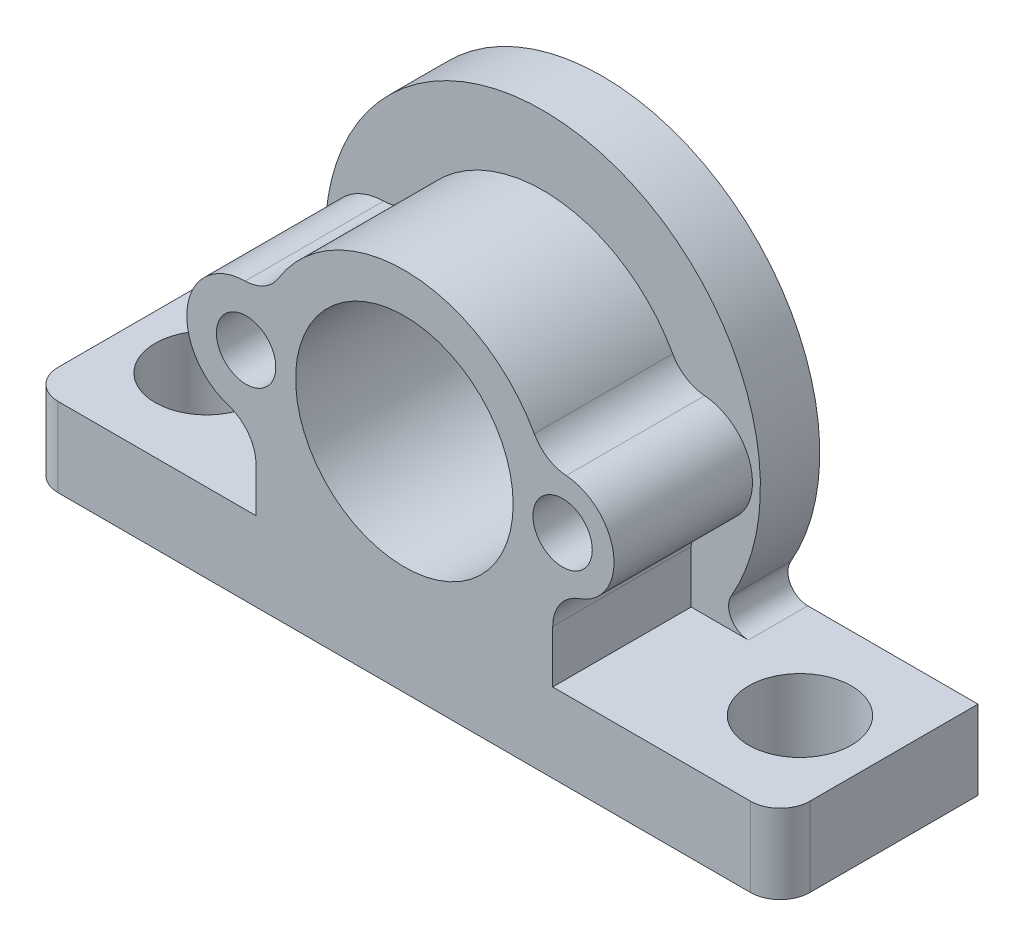
ISO-10303-21;
HEADER;
FILE_DESCRIPTION(('STEP AP214'),'2;1');
FILE_NAME('part.step','',(''),(''),'','','');
FILE_SCHEMA(('AUTOMOTIVE_DESIGN { 1 0 10303 214 1 1 1 1 }'));
ENDSEC;
DATA;
#1=APPLICATION_CONTEXT('core data for automotive mechanical design processes');
#2=APPLICATION_PROTOCOL_DEFINITION('international standard','automotive_design',2000,#1);
#3=PRODUCT_CONTEXT('',#1,'mechanical');
#4=PRODUCT('Part','Part','',(#3));
#5=PRODUCT_RELATED_PRODUCT_CATEGORY('part','',(#4));
#6=PRODUCT_DEFINITION_FORMATION('','',#4);
#7=PRODUCT_DEFINITION_CONTEXT('part definition',#1,'design');
#8=PRODUCT_DEFINITION('design','',#6,#7);
#9=PRODUCT_DEFINITION_SHAPE('','',#8);
#10=(LENGTH_UNIT() NAMED_UNIT(*) SI_UNIT(.MILLI.,.METRE.));
#11=(NAMED_UNIT(*) PLANE_ANGLE_UNIT() SI_UNIT($,.RADIAN.));
#12=(NAMED_UNIT(*) SI_UNIT($,.STERADIAN.) SOLID_ANGLE_UNIT());
#13=UNCERTAINTY_MEASURE_WITH_UNIT(LENGTH_MEASURE(1.E-05),#10,'distance_accuracy_value','');
#14=(GEOMETRIC_REPRESENTATION_CONTEXT(3) GLOBAL_UNCERTAINTY_ASSIGNED_CONTEXT((#13)) GLOBAL_UNIT_ASSIGNED_CONTEXT((#10,
#11,#12)) REPRESENTATION_CONTEXT('',''));
#15=CARTESIAN_POINT('',(0.,0.,0.));
#16=DIRECTION('',(0.,0.,1.));
#17=DIRECTION('',(1.,0.,0.));
#18=AXIS2_PLACEMENT_3D('',#15,#16,#17);
#19=CARTESIAN_POINT('',(0.,0.,3.));
#20=DIRECTION('',(0.,0.,-1.));
#21=DIRECTION('',(-1.,0.,0.));
#22=AXIS2_PLACEMENT_3D('',#19,#20,#21);
#23=PLANE('',#22);
#24=CARTESIAN_POINT('',(7.99999999999999,0.,3.));
#25=DIRECTION('',(0.,0.,-1.));
#26=DIRECTION('',(-1.,0.,0.));
#27=AXIS2_PLACEMENT_3D('',#24,#25,#26);
#28=CIRCLE('',#27,2.6);
#29=CARTESIAN_POINT('',(8.17980978260869,2.59377494052168,3.));
#30=VERTEX_POINT('',#29);
#31=CARTESIAN_POINT('',(8.84782608695652,-2.45788342406143,3.));
#32=VERTEX_POINT('',#31);
#33=EDGE_CURVE('E481',#30,#32,#28,.T.);
#34=ORIENTED_EDGE('',*,*,#33,.T.);
#35=CARTESIAN_POINT('',(9.5,-4.34856298103177,3.));
#36=DIRECTION('',(0.,0.,-1.));
#37=DIRECTION('',(-1.,0.,0.));
#38=AXIS2_PLACEMENT_3D('',#35,#36,#37);
#39=CIRCLE('',#38,2.);
#40=CARTESIAN_POINT('',(7.5,-4.34856298103177,3.));
#41=VERTEX_POINT('',#40);
#42=EDGE_CURVE('E271',#32,#41,#39,.F.);
#43=ORIENTED_EDGE('',*,*,#42,.T.);
#44=DIRECTION('',(0.,-1.,0.));
#45=VECTOR('',#44,1.);
#46=CARTESIAN_POINT('',(7.5,0.,3.));
#47=LINE('',#46,#45);
#48=CARTESIAN_POINT('',(7.5,-7.,3.));
#49=VERTEX_POINT('',#48);
#50=EDGE_CURVE('E194',#41,#49,#47,.T.);
#51=ORIENTED_EDGE('',*,*,#50,.T.);
#52=DIRECTION('',(-1.,0.,0.));
#53=VECTOR('',#52,1.);
#54=CARTESIAN_POINT('',(0.,-7.,3.));
#55=LINE('',#54,#53);
#56=CARTESIAN_POINT('',(10.3923048454133,-7.,3.));
#57=VERTEX_POINT('',#56);
#58=EDGE_CURVE('E340',#57,#49,#55,.T.);
#59=ORIENTED_EDGE('',*,*,#58,.F.);
#60=CARTESIAN_POINT('',(10.3923048454133,-6.,3.));
#61=DIRECTION('',(0.,0.,-1.));
#62=DIRECTION('',(-1.,0.,0.));
#63=AXIS2_PLACEMENT_3D('',#60,#61,#62);
#64=CIRCLE('',#63,1.);
#65=CARTESIAN_POINT('',(9.52627944162882,-5.5,3.));
#66=VERTEX_POINT('',#65);
#67=EDGE_CURVE('E313',#57,#66,#64,.T.);
#68=ORIENTED_EDGE('',*,*,#67,.T.);
#69=CARTESIAN_POINT('',(0.,0.,3.));
#70=DIRECTION('',(0.,0.,-1.));
#71=DIRECTION('',(-1.,0.,0.));
#72=AXIS2_PLACEMENT_3D('',#69,#70,#71);
#73=CIRCLE('',#72,11.);
#74=CARTESIAN_POINT('',(-11.,0.,3.));
#75=VERTEX_POINT('',#74);
#76=EDGE_CURVE('E331',#75,#66,#73,.T.);
#77=ORIENTED_EDGE('',*,*,#76,.F.);
#78=CARTESIAN_POINT('',(-8.,0.,3.));
#79=DIRECTION('',(0.,0.,-1.));
#80=DIRECTION('',(-1.,0.,0.));
#81=AXIS2_PLACEMENT_3D('',#78,#79,#80);
#82=CIRCLE('',#81,3.);
#83=CARTESIAN_POINT('',(-8.046875,2.99963376670803,3.));
#84=VERTEX_POINT('',#83);
#85=EDGE_CURVE('E249',#75,#84,#82,.T.);
#86=ORIENTED_EDGE('',*,*,#85,.T.);
#87=CARTESIAN_POINT('',(-8.078125,4.99938961118005,3.));
#88=DIRECTION('',(0.,0.,-1.));
#89=DIRECTION('',(-1.,0.,0.));
#90=AXIS2_PLACEMENT_3D('',#87,#88,#89);
#91=CIRCLE('',#90,2.);
#92=CARTESIAN_POINT('',(-6.37746710526316,3.94688653514214,3.));
#93=VERTEX_POINT('',#92);
#94=EDGE_CURVE('E267',#84,#93,#91,.F.);
#95=ORIENTED_EDGE('',*,*,#94,.T.);
#96=CARTESIAN_POINT('',(0.,0.,3.));
#97=DIRECTION('',(0.,0.,-1.));
#98=DIRECTION('',(-1.,0.,0.));
#99=AXIS2_PLACEMENT_3D('',#96,#97,#98);
#100=CIRCLE('',#99,7.5);
#101=CARTESIAN_POINT('',(6.56694078947368,3.62288402623473,3.));
#102=VERTEX_POINT('',#101);
#103=EDGE_CURVE('E343',#93,#102,#100,.T.);
#104=ORIENTED_EDGE('',*,*,#103,.T.);
#105=CARTESIAN_POINT('',(8.318125,4.58898643323066,3.));
#106=DIRECTION('',(0.,0.,-1.));
#107=DIRECTION('',(-1.,0.,0.));
#108=AXIS2_PLACEMENT_3D('',#105,#106,#107);
#109=CIRCLE('',#108,2.);
#110=EDGE_CURVE('E269',#102,#30,#109,.F.);
#111=ORIENTED_EDGE('',*,*,#110,.T.);
#112=EDGE_LOOP('',(#34,#43,#51,#59,#68,#77,#86,#95,#104,#111));
#113=FACE_BOUND('',#112,.T.);
#114=ADVANCED_FACE('F35',(#113),#23,.F.);
#115=CARTESIAN_POINT('',(0.,0.,10.));
#116=DIRECTION('',(0.,0.,-1.));
#117=DIRECTION('',(-1.,0.,0.));
#118=AXIS2_PLACEMENT_3D('',#115,#116,#117);
#119=CYLINDRICAL_SURFACE('',#118,7.5);
#120=CARTESIAN_POINT('',(0.,0.,10.));
#121=DIRECTION('',(0.,0.,1.));
#122=DIRECTION('',(1.,0.,0.));
#123=AXIS2_PLACEMENT_3D('',#120,#121,#122);
#124=CIRCLE('',#123,7.5);
#125=CARTESIAN_POINT('',(6.56694078947368,3.62288402623473,10.));
#126=VERTEX_POINT('',#125);
#127=CARTESIAN_POINT('',(-6.37746710526316,3.94688653514214,10.));
#128=VERTEX_POINT('',#127);
#129=EDGE_CURVE('E202',#126,#128,#124,.T.);
#130=ORIENTED_EDGE('',*,*,#129,.F.);
#131=DIRECTION('',(0.,0.,-1.));
#132=VECTOR('',#131,1.);
#133=CARTESIAN_POINT('',(6.56694078947368,3.62288402623473,10.));
#134=LINE('',#133,#132);
#135=EDGE_CURVE('E276',#126,#102,#134,.T.);
#136=ORIENTED_EDGE('',*,*,#135,.T.);
#137=ORIENTED_EDGE('',*,*,#103,.F.);
#138=DIRECTION('',(0.,0.,-1.));
#139=VECTOR('',#138,1.);
#140=CARTESIAN_POINT('',(-6.37746710526316,3.94688653514215,10.));
#141=LINE('',#140,#139);
#142=EDGE_CURVE('E273',#93,#128,#141,.F.);
#143=ORIENTED_EDGE('',*,*,#142,.T.);
#144=EDGE_LOOP('',(#130,#136,#137,#143));
#145=FACE_BOUND('',#144,.T.);
#146=ADVANCED_FACE('F377',(#145),#119,.T.);
#147=CARTESIAN_POINT('',(-7.5,0.,10.));
#148=DIRECTION('',(-1.,0.,0.));
#149=DIRECTION('',(0.,0.,1.));
#150=AXIS2_PLACEMENT_3D('',#147,#148,#149);
#151=PLANE('',#150);
#152=DIRECTION('',(0.,1.,0.));
#153=VECTOR('',#152,1.);
#154=CARTESIAN_POINT('',(-7.5,0.,10.));
#155=LINE('',#154,#153);
#156=CARTESIAN_POINT('',(-7.5,-7.,10.));
#157=VERTEX_POINT('',#156);
#158=CARTESIAN_POINT('',(-7.5,-4.76969600708473,10.));
#159=VERTEX_POINT('',#158);
#160=EDGE_CURVE('E186',#157,#159,#155,.T.);
#161=ORIENTED_EDGE('',*,*,#160,.T.);
#162=DIRECTION('',(0.,0.,-1.));
#163=VECTOR('',#162,1.);
#164=CARTESIAN_POINT('',(-7.5,-4.76969600708473,3.));
#165=LINE('',#164,#163);
#166=CARTESIAN_POINT('',(-7.5,-4.76969600708473,3.));
#167=VERTEX_POINT('',#166);
#168=EDGE_CURVE('E255',#159,#167,#165,.T.);
#169=ORIENTED_EDGE('',*,*,#168,.T.);
#170=DIRECTION('',(0.,-1.,0.));
#171=VECTOR('',#170,1.);
#172=CARTESIAN_POINT('',(-7.5,0.,3.));
#173=LINE('',#172,#171);
#174=CARTESIAN_POINT('',(-7.5,-7.,3.));
#175=VERTEX_POINT('',#174);
#176=EDGE_CURVE('E193',#167,#175,#173,.T.);
#177=ORIENTED_EDGE('',*,*,#176,.T.);
#178=DIRECTION('',(0.,0.,-1.));
#179=VECTOR('',#178,1.);
#180=CARTESIAN_POINT('',(-7.5,-7.,10.));
#181=LINE('',#180,#179);
#182=EDGE_CURVE('E177',#157,#175,#181,.T.);
#183=ORIENTED_EDGE('',*,*,#182,.F.);
#184=EDGE_LOOP('',(#161,#169,#177,#183));
#185=FACE_BOUND('',#184,.T.);
#186=ADVANCED_FACE('F190',(#185),#151,.T.);
#187=CARTESIAN_POINT('',(7.5,0.,10.));
#188=DIRECTION('',(-1.,0.,0.));
#189=DIRECTION('',(0.,-1.,0.));
#190=AXIS2_PLACEMENT_3D('',#187,#188,#189);
#191=PLANE('',#190);
#192=ORIENTED_EDGE('',*,*,#50,.F.);
#193=DIRECTION('',(0.,0.,1.));
#194=VECTOR('',#193,1.);
#195=CARTESIAN_POINT('',(7.5,-4.34856298103177,10.));
#196=LINE('',#195,#194);
#197=CARTESIAN_POINT('',(7.5,-4.34856298103177,10.));
#198=VERTEX_POINT('',#197);
#199=EDGE_CURVE('E259',#41,#198,#196,.T.);
#200=ORIENTED_EDGE('',*,*,#199,.T.);
#201=DIRECTION('',(0.,1.,0.));
#202=VECTOR('',#201,1.);
#203=CARTESIAN_POINT('',(7.5,0.,10.));
#204=LINE('',#203,#202);
#205=CARTESIAN_POINT('',(7.5,-7.,10.));
#206=VERTEX_POINT('',#205);
#207=EDGE_CURVE('E214',#206,#198,#204,.T.);
#208=ORIENTED_EDGE('',*,*,#207,.F.);
#209=DIRECTION('',(0.,0.,-1.));
#210=VECTOR('',#209,1.);
#211=CARTESIAN_POINT('',(7.5,-7.,10.));
#212=LINE('',#211,#210);
#213=EDGE_CURVE('E217',#206,#49,#212,.T.);
#214=ORIENTED_EDGE('',*,*,#213,.T.);
#215=EDGE_LOOP('',(#192,#200,#208,#214));
#216=FACE_BOUND('',#215,.T.);
#217=ADVANCED_FACE('F411',(#216),#191,.F.);
#218=CARTESIAN_POINT('',(0.,-7.,10.));
#219=DIRECTION('',(0.,1.,0.));
#220=DIRECTION('',(0.,0.,1.));
#221=AXIS2_PLACEMENT_3D('',#218,#219,#220);
#222=PLANE('',#221);
#223=DIRECTION('',(-1.,0.,0.));
#224=VECTOR('',#223,1.);
#225=CARTESIAN_POINT('',(0.,-7.,3.));
#226=LINE('',#225,#224);
#227=CARTESIAN_POINT('',(-10.3923048454133,-7.,3.));
#228=VERTEX_POINT('',#227);
#229=EDGE_CURVE('E50',#175,#228,#226,.T.);
#230=ORIENTED_EDGE('',*,*,#229,.T.);
#231=DIRECTION('',(0.,0.,1.));
#232=VECTOR('',#231,1.);
#233=CARTESIAN_POINT('',(-10.3923048454133,-7.,0.));
#234=LINE('',#233,#232);
#235=CARTESIAN_POINT('',(-10.3923048454133,-7.,0.));
#236=VERTEX_POINT('',#235);
#237=EDGE_CURVE('E55',#228,#236,#234,.F.);
#238=ORIENTED_EDGE('',*,*,#237,.T.);
#239=DIRECTION('',(1.,0.,0.));
#240=VECTOR('',#239,1.);
#241=CARTESIAN_POINT('',(0.,-7.,0.));
#242=LINE('',#241,#240);
#243=CARTESIAN_POINT('',(-19.,-7.,0.));
#244=VERTEX_POINT('',#243);
#245=EDGE_CURVE('E221',#244,#236,#242,.T.);
#246=ORIENTED_EDGE('',*,*,#245,.F.);
#247=DIRECTION('',(0.,0.,-1.));
#248=VECTOR('',#247,1.);
#249=CARTESIAN_POINT('',(-19.,-7.,10.));
#250=LINE('',#249,#248);
#251=CARTESIAN_POINT('',(-19.,-7.,8.5));
#252=VERTEX_POINT('',#251);
#253=EDGE_CURVE('E195',#252,#244,#250,.T.);
#254=ORIENTED_EDGE('',*,*,#253,.F.);
#255=CARTESIAN_POINT('',(-17.5,-7.,8.5));
#256=DIRECTION('',(0.,1.,0.));
#257=DIRECTION('',(0.,0.,1.));
#258=AXIS2_PLACEMENT_3D('',#255,#256,#257);
#259=CIRCLE('',#258,1.5);
#260=CARTESIAN_POINT('',(-17.5,-7.,10.));
#261=VERTEX_POINT('',#260);
#262=EDGE_CURVE('E180',#252,#261,#259,.T.);
#263=ORIENTED_EDGE('',*,*,#262,.T.);
#264=DIRECTION('',(1.,0.,0.));
#265=VECTOR('',#264,1.);
#266=CARTESIAN_POINT('',(0.,-7.,10.));
#267=LINE('',#266,#265);
#268=EDGE_CURVE('E173',#261,#157,#267,.T.);
#269=ORIENTED_EDGE('',*,*,#268,.T.);
#270=ORIENTED_EDGE('',*,*,#182,.T.);
#271=EDGE_LOOP('',(#230,#238,#246,#254,#263,#269,#270));
#272=FACE_BOUND('',#271,.T.);
#273=CARTESIAN_POINT('',(-15.,-7.,5.));
#274=DIRECTION('',(0.,1.,0.));
#275=DIRECTION('',(0.,0.,1.));
#276=AXIS2_PLACEMENT_3D('',#273,#274,#275);
#277=CIRCLE('',#276,2.6);
#278=CARTESIAN_POINT('',(-15.,-7.,7.6));
#279=VERTEX_POINT('',#278);
#280=EDGE_CURVE('E352',#279,#279,#277,.T.);
#281=ORIENTED_EDGE('',*,*,#280,.F.);
#282=EDGE_LOOP('',(#281));
#283=FACE_BOUND('',#282,.T.);
#284=ADVANCED_FACE('F175',(#272,#283),#222,.T.);
#285=CARTESIAN_POINT('',(-19.,0.,10.));
#286=DIRECTION('',(1.,0.,0.));
#287=DIRECTION('',(0.,0.,-1.));
#288=AXIS2_PLACEMENT_3D('',#285,#286,#287);
#289=PLANE('',#288);
#290=DIRECTION('',(0.,0.,-1.));
#291=VECTOR('',#290,1.);
#292=CARTESIAN_POINT('',(-19.,-11.,10.));
#293=LINE('',#292,#291);
#294=CARTESIAN_POINT('',(-19.,-11.,8.5));
#295=VERTEX_POINT('',#294);
#296=CARTESIAN_POINT('',(-19.,-11.,0.));
#297=VERTEX_POINT('',#296);
#298=EDGE_CURVE('E242',#295,#297,#293,.T.);
#299=ORIENTED_EDGE('',*,*,#298,.F.);
#300=DIRECTION('',(0.,-1.,0.));
#301=VECTOR('',#300,1.);
#302=CARTESIAN_POINT('',(-19.,-7.,8.5));
#303=LINE('',#302,#301);
#304=EDGE_CURVE('E298',#295,#252,#303,.F.);
#305=ORIENTED_EDGE('',*,*,#304,.T.);
#306=ORIENTED_EDGE('',*,*,#253,.T.);
#307=DIRECTION('',(0.,-1.,0.));
#308=VECTOR('',#307,1.);
#309=CARTESIAN_POINT('',(-19.,0.,0.));
#310=LINE('',#309,#308);
#311=EDGE_CURVE('E224',#244,#297,#310,.T.);
#312=ORIENTED_EDGE('',*,*,#311,.T.);
#313=EDGE_LOOP('',(#299,#305,#306,#312));
#314=FACE_BOUND('',#313,.T.);
#315=ADVANCED_FACE('F410',(#314),#289,.F.);
#316=CARTESIAN_POINT('',(0.,-11.,10.));
#317=DIRECTION('',(0.,-1.,0.));
#318=DIRECTION('',(0.,0.,-1.));
#319=AXIS2_PLACEMENT_3D('',#316,#317,#318);
#320=PLANE('',#319);
#321=DIRECTION('',(0.,0.,-1.));
#322=VECTOR('',#321,1.);
#323=CARTESIAN_POINT('',(19.,-11.,10.));
#324=LINE('',#323,#322);
#325=CARTESIAN_POINT('',(19.,-11.,8.5));
#326=VERTEX_POINT('',#325);
#327=CARTESIAN_POINT('',(19.,-11.,0.));
#328=VERTEX_POINT('',#327);
#329=EDGE_CURVE('E240',#326,#328,#324,.T.);
#330=ORIENTED_EDGE('',*,*,#329,.F.);
#331=CARTESIAN_POINT('',(17.5,-11.,8.5));
#332=DIRECTION('',(0.,-1.,0.));
#333=DIRECTION('',(0.,0.,-1.));
#334=AXIS2_PLACEMENT_3D('',#331,#332,#333);
#335=CIRCLE('',#334,1.5);
#336=CARTESIAN_POINT('',(17.5,-11.,10.));
#337=VERTEX_POINT('',#336);
#338=EDGE_CURVE('E290',#326,#337,#335,.T.);
#339=ORIENTED_EDGE('',*,*,#338,.T.);
#340=DIRECTION('',(-1.,0.,0.));
#341=VECTOR('',#340,1.);
#342=CARTESIAN_POINT('',(0.,-11.,10.));
#343=LINE('',#342,#341);
#344=CARTESIAN_POINT('',(-17.5,-11.,10.));
#345=VERTEX_POINT('',#344);
#346=EDGE_CURVE('E185',#337,#345,#343,.T.);
#347=ORIENTED_EDGE('',*,*,#346,.T.);
#348=CARTESIAN_POINT('',(-17.5,-11.,8.5));
#349=DIRECTION('',(0.,-1.,0.));
#350=DIRECTION('',(0.,0.,-1.));
#351=AXIS2_PLACEMENT_3D('',#348,#349,#350);
#352=CIRCLE('',#351,1.5);
#353=EDGE_CURVE('E288',#345,#295,#352,.T.);
#354=ORIENTED_EDGE('',*,*,#353,.T.);
#355=ORIENTED_EDGE('',*,*,#298,.T.);
#356=DIRECTION('',(-1.,0.,0.));
#357=VECTOR('',#356,1.);
#358=CARTESIAN_POINT('',(0.,-11.,0.));
#359=LINE('',#358,#357);
#360=EDGE_CURVE('E227',#328,#297,#359,.T.);
#361=ORIENTED_EDGE('',*,*,#360,.F.);
#362=EDGE_LOOP('',(#330,#339,#347,#354,#355,#361));
#363=FACE_BOUND('',#362,.T.);
#364=CARTESIAN_POINT('',(15.,-11.,5.));
#365=DIRECTION('',(0.,1.,0.));
#366=DIRECTION('',(0.,0.,-1.));
#367=AXIS2_PLACEMENT_3D('',#364,#365,#366);
#368=CIRCLE('',#367,2.6);
#369=CARTESIAN_POINT('',(15.,-11.,2.4));
#370=VERTEX_POINT('',#369);
#371=EDGE_CURVE('E349',#370,#370,#368,.T.);
#372=ORIENTED_EDGE('',*,*,#371,.T.);
#373=EDGE_LOOP('',(#372));
#374=FACE_BOUND('',#373,.T.);
#375=CARTESIAN_POINT('',(-15.,-11.,5.));
#376=DIRECTION('',(0.,1.,0.));
#377=DIRECTION('',(0.,0.,1.));
#378=AXIS2_PLACEMENT_3D('',#375,#376,#377);
#379=CIRCLE('',#378,2.6);
#380=CARTESIAN_POINT('',(-15.,-11.,7.6));
#381=VERTEX_POINT('',#380);
#382=EDGE_CURVE('E222',#381,#381,#379,.T.);
#383=ORIENTED_EDGE('',*,*,#382,.T.);
#384=EDGE_LOOP('',(#383));
#385=FACE_BOUND('',#384,.T.);
#386=ADVANCED_FACE('F417',(#363,#374,#385),#320,.T.);
#387=CARTESIAN_POINT('',(19.,0.,10.));
#388=DIRECTION('',(1.,0.,0.));
#389=DIRECTION('',(0.,0.,-1.));
#390=AXIS2_PLACEMENT_3D('',#387,#388,#389);
#391=PLANE('',#390);
#392=DIRECTION('',(0.,0.,-1.));
#393=VECTOR('',#392,1.);
#394=CARTESIAN_POINT('',(19.,-7.,10.));
#395=LINE('',#394,#393);
#396=CARTESIAN_POINT('',(19.,-7.,8.5));
#397=VERTEX_POINT('',#396);
#398=CARTESIAN_POINT('',(19.,-7.,0.));
#399=VERTEX_POINT('',#398);
#400=EDGE_CURVE('E237',#397,#399,#395,.T.);
#401=ORIENTED_EDGE('',*,*,#400,.F.);
#402=DIRECTION('',(0.,-1.,0.));
#403=VECTOR('',#402,1.);
#404=CARTESIAN_POINT('',(19.,0.,8.5));
#405=LINE('',#404,#403);
#406=EDGE_CURVE('E285',#397,#326,#405,.T.);
#407=ORIENTED_EDGE('',*,*,#406,.T.);
#408=ORIENTED_EDGE('',*,*,#329,.T.);
#409=DIRECTION('',(0.,-1.,0.));
#410=VECTOR('',#409,1.);
#411=CARTESIAN_POINT('',(19.,0.,0.));
#412=LINE('',#411,#410);
#413=EDGE_CURVE('E230',#399,#328,#412,.T.);
#414=ORIENTED_EDGE('',*,*,#413,.F.);
#415=EDGE_LOOP('',(#401,#407,#408,#414));
#416=FACE_BOUND('',#415,.T.);
#417=ADVANCED_FACE('F563',(#416),#391,.T.);
#418=CARTESIAN_POINT('',(0.,-7.,10.));
#419=DIRECTION('',(0.,1.,0.));
#420=DIRECTION('',(0.,0.,1.));
#421=AXIS2_PLACEMENT_3D('',#418,#419,#420);
#422=PLANE('',#421);
#423=DIRECTION('',(1.,0.,0.));
#424=VECTOR('',#423,1.);
#425=CARTESIAN_POINT('',(0.,-7.,0.));
#426=LINE('',#425,#424);
#427=CARTESIAN_POINT('',(10.3923048454133,-7.,0.));
#428=VERTEX_POINT('',#427);
#429=EDGE_CURVE('E233',#428,#399,#426,.T.);
#430=ORIENTED_EDGE('',*,*,#429,.F.);
#431=DIRECTION('',(0.,0.,1.));
#432=VECTOR('',#431,1.);
#433=CARTESIAN_POINT('',(10.3923048454133,-7.,3.));
#434=LINE('',#433,#432);
#435=EDGE_CURVE('E307',#428,#57,#434,.T.);
#436=ORIENTED_EDGE('',*,*,#435,.T.);
#437=ORIENTED_EDGE('',*,*,#58,.T.);
#438=ORIENTED_EDGE('',*,*,#213,.F.);
#439=DIRECTION('',(1.,0.,0.));
#440=VECTOR('',#439,1.);
#441=CARTESIAN_POINT('',(0.,-7.,10.));
#442=LINE('',#441,#440);
#443=CARTESIAN_POINT('',(17.5,-7.,10.));
#444=VERTEX_POINT('',#443);
#445=EDGE_CURVE('E211',#206,#444,#442,.T.);
#446=ORIENTED_EDGE('',*,*,#445,.T.);
#447=CARTESIAN_POINT('',(17.5,-7.,8.5));
#448=DIRECTION('',(0.,1.,0.));
#449=DIRECTION('',(0.,0.,1.));
#450=AXIS2_PLACEMENT_3D('',#447,#448,#449);
#451=CIRCLE('',#450,1.5);
#452=EDGE_CURVE('E296',#444,#397,#451,.T.);
#453=ORIENTED_EDGE('',*,*,#452,.T.);
#454=ORIENTED_EDGE('',*,*,#400,.T.);
#455=EDGE_LOOP('',(#430,#436,#437,#438,#446,#453,#454));
#456=FACE_BOUND('',#455,.T.);
#457=CARTESIAN_POINT('',(15.,-7.,5.));
#458=DIRECTION('',(0.,1.,0.));
#459=DIRECTION('',(0.,0.,-1.));
#460=AXIS2_PLACEMENT_3D('',#457,#458,#459);
#461=CIRCLE('',#460,2.6);
#462=CARTESIAN_POINT('',(15.,-7.,2.4));
#463=VERTEX_POINT('',#462);
#464=EDGE_CURVE('E348',#463,#463,#461,.T.);
#465=ORIENTED_EDGE('',*,*,#464,.F.);
#466=EDGE_LOOP('',(#465));
#467=FACE_BOUND('',#466,.T.);
#468=ADVANCED_FACE('F372',(#456,#467),#422,.T.);
#469=CARTESIAN_POINT('',(0.,0.,10.));
#470=DIRECTION('',(0.,0.,-1.));
#471=DIRECTION('',(-1.,0.,0.));
#472=AXIS2_PLACEMENT_3D('',#469,#470,#471);
#473=CYLINDRICAL_SURFACE('',#472,5.5);
#474=CARTESIAN_POINT('',(0.,0.,0.));
#475=DIRECTION('',(0.,0.,1.));
#476=DIRECTION('',(1.,0.,0.));
#477=AXIS2_PLACEMENT_3D('',#474,#475,#476);
#478=CIRCLE('',#477,5.5);
#479=CARTESIAN_POINT('',(5.5,0.,0.));
#480=VERTEX_POINT('',#479);
#481=EDGE_CURVE('E218',#480,#480,#478,.T.);
#482=ORIENTED_EDGE('',*,*,#481,.F.);
#483=EDGE_LOOP('',(#482));
#484=FACE_BOUND('',#483,.T.);
#485=CARTESIAN_POINT('',(0.,0.,10.));
#486=DIRECTION('',(0.,0.,1.));
#487=DIRECTION('',(1.,0.,0.));
#488=AXIS2_PLACEMENT_3D('',#485,#486,#487);
#489=CIRCLE('',#488,5.5);
#490=CARTESIAN_POINT('',(5.5,0.,10.));
#491=VERTEX_POINT('',#490);
#492=EDGE_CURVE('E205',#491,#491,#489,.T.);
#493=ORIENTED_EDGE('',*,*,#492,.T.);
#494=EDGE_LOOP('',(#493));
#495=FACE_BOUND('',#494,.T.);
#496=ADVANCED_FACE('F361',(#484,#495),#473,.F.);
#497=CARTESIAN_POINT('',(0.,0.,10.));
#498=DIRECTION('',(0.,0.,1.));
#499=DIRECTION('',(1.,0.,0.));
#500=AXIS2_PLACEMENT_3D('',#497,#498,#499);
#501=PLANE('',#500);
#502=ORIENTED_EDGE('',*,*,#346,.F.);
#503=DIRECTION('',(0.,-1.,0.));
#504=VECTOR('',#503,1.);
#505=CARTESIAN_POINT('',(17.5,0.,10.));
#506=LINE('',#505,#504);
#507=EDGE_CURVE('E294',#337,#444,#506,.F.);
#508=ORIENTED_EDGE('',*,*,#507,.T.);
#509=ORIENTED_EDGE('',*,*,#445,.F.);
#510=ORIENTED_EDGE('',*,*,#207,.T.);
#511=CARTESIAN_POINT('',(9.5,-4.34856298103177,10.));
#512=DIRECTION('',(0.,0.,1.));
#513=DIRECTION('',(1.,0.,0.));
#514=AXIS2_PLACEMENT_3D('',#511,#512,#513);
#515=CIRCLE('',#514,2.);
#516=CARTESIAN_POINT('',(8.84782608695652,-2.45788342406143,10.));
#517=VERTEX_POINT('',#516);
#518=EDGE_CURVE('E279',#198,#517,#515,.F.);
#519=ORIENTED_EDGE('',*,*,#518,.T.);
#520=CARTESIAN_POINT('',(7.99999999999999,0.,10.));
#521=DIRECTION('',(0.,0.,1.));
#522=DIRECTION('',(1.,0.,0.));
#523=AXIS2_PLACEMENT_3D('',#520,#521,#522);
#524=CIRCLE('',#523,2.6);
#525=CARTESIAN_POINT('',(8.17980978260869,2.59377494052168,10.));
#526=VERTEX_POINT('',#525);
#527=EDGE_CURVE('E475',#517,#526,#524,.T.);
#528=ORIENTED_EDGE('',*,*,#527,.T.);
#529=CARTESIAN_POINT('',(8.318125,4.58898643323066,10.));
#530=DIRECTION('',(0.,0.,1.));
#531=DIRECTION('',(1.,0.,0.));
#532=AXIS2_PLACEMENT_3D('',#529,#530,#531);
#533=CIRCLE('',#532,2.);
#534=EDGE_CURVE('E281',#526,#126,#533,.F.);
#535=ORIENTED_EDGE('',*,*,#534,.T.);
#536=ORIENTED_EDGE('',*,*,#129,.T.);
#537=CARTESIAN_POINT('',(-8.078125,4.99938961118005,10.));
#538=DIRECTION('',(0.,0.,1.));
#539=DIRECTION('',(1.,0.,0.));
#540=AXIS2_PLACEMENT_3D('',#537,#538,#539);
#541=CIRCLE('',#540,2.);
#542=CARTESIAN_POINT('',(-8.046875,2.99963376670803,10.));
#543=VERTEX_POINT('',#542);
#544=EDGE_CURVE('E283',#128,#543,#541,.F.);
#545=ORIENTED_EDGE('',*,*,#544,.T.);
#546=CARTESIAN_POINT('',(-8.,0.,10.));
#547=DIRECTION('',(0.,0.,1.));
#548=DIRECTION('',(1.,0.,0.));
#549=AXIS2_PLACEMENT_3D('',#546,#547,#548);
#550=CIRCLE('',#549,3.);
#551=CARTESIAN_POINT('',(-8.9,-2.86181760425084,10.));
#552=VERTEX_POINT('',#551);
#553=EDGE_CURVE('E483',#543,#552,#550,.T.);
#554=ORIENTED_EDGE('',*,*,#553,.T.);
#555=CARTESIAN_POINT('',(-9.5,-4.76969600708473,10.));
#556=DIRECTION('',(0.,0.,1.));
#557=DIRECTION('',(1.,0.,0.));
#558=AXIS2_PLACEMENT_3D('',#555,#556,#557);
#559=CIRCLE('',#558,2.);
#560=EDGE_CURVE('E201',#552,#159,#559,.F.);
#561=ORIENTED_EDGE('',*,*,#560,.T.);
#562=ORIENTED_EDGE('',*,*,#160,.F.);
#563=ORIENTED_EDGE('',*,*,#268,.F.);
#564=DIRECTION('',(0.,-1.,0.));
#565=VECTOR('',#564,1.);
#566=CARTESIAN_POINT('',(-17.5,-11.,10.));
#567=LINE('',#566,#565);
#568=EDGE_CURVE('E292',#261,#345,#567,.T.);
#569=ORIENTED_EDGE('',*,*,#568,.T.);
#570=EDGE_LOOP('',(#502,#508,#509,#510,#519,#528,#535,#536,#545,#554,#561,#562,#563,#569));
#571=FACE_BOUND('',#570,.T.);
#572=CARTESIAN_POINT('',(7.99999999999999,0.,10.));
#573=DIRECTION('',(0.,0.,-1.));
#574=DIRECTION('',(1.,0.,0.));
#575=AXIS2_PLACEMENT_3D('',#572,#573,#574);
#576=CIRCLE('',#575,1.5);
#577=CARTESIAN_POINT('',(9.49999999999998,0.,10.));
#578=VERTEX_POINT('',#577);
#579=EDGE_CURVE('E489',#578,#578,#576,.T.);
#580=ORIENTED_EDGE('',*,*,#579,.T.);
#581=EDGE_LOOP('',(#580));
#582=FACE_BOUND('',#581,.T.);
#583=CARTESIAN_POINT('',(-8.,0.,10.));
#584=DIRECTION('',(0.,0.,-1.));
#585=DIRECTION('',(-1.,0.,0.));
#586=AXIS2_PLACEMENT_3D('',#583,#584,#585);
#587=CIRCLE('',#586,1.5);
#588=CARTESIAN_POINT('',(-9.5,0.,10.));
#589=VERTEX_POINT('',#588);
#590=EDGE_CURVE('E332',#589,#589,#587,.T.);
#591=ORIENTED_EDGE('',*,*,#590,.T.);
#592=EDGE_LOOP('',(#591));
#593=FACE_BOUND('',#592,.T.);
#594=ORIENTED_EDGE('',*,*,#492,.F.);
#595=EDGE_LOOP('',(#594));
#596=FACE_BOUND('',#595,.T.);
#597=ADVANCED_FACE('F198',(#571,#582,#593,#596),#501,.T.);
#598=CARTESIAN_POINT('',(0.,0.,0.));
#599=DIRECTION('',(0.,0.,1.));
#600=DIRECTION('',(1.,0.,0.));
#601=AXIS2_PLACEMENT_3D('',#598,#599,#600);
#602=PLANE('',#601);
#603=CARTESIAN_POINT('',(7.99999999999999,0.,0.));
#604=DIRECTION('',(0.,0.,-1.));
#605=DIRECTION('',(1.,0.,0.));
#606=AXIS2_PLACEMENT_3D('',#603,#604,#605);
#607=CIRCLE('',#606,1.5);
#608=CARTESIAN_POINT('',(9.49999999999998,0.,0.));
#609=VERTEX_POINT('',#608);
#610=EDGE_CURVE('E485',#609,#609,#607,.T.);
#611=ORIENTED_EDGE('',*,*,#610,.F.);
#612=EDGE_LOOP('',(#611));
#613=FACE_BOUND('',#612,.T.);
#614=ORIENTED_EDGE('',*,*,#481,.T.);
#615=EDGE_LOOP('',(#614));
#616=FACE_BOUND('',#615,.T.);
#617=CARTESIAN_POINT('',(-8.,0.,0.));
#618=DIRECTION('',(0.,0.,-1.));
#619=DIRECTION('',(-1.,0.,0.));
#620=AXIS2_PLACEMENT_3D('',#617,#618,#619);
#621=CIRCLE('',#620,1.5);
#622=CARTESIAN_POINT('',(-9.5,0.,0.));
#623=VERTEX_POINT('',#622);
#624=EDGE_CURVE('E336',#623,#623,#621,.T.);
#625=ORIENTED_EDGE('',*,*,#624,.F.);
#626=EDGE_LOOP('',(#625));
#627=FACE_BOUND('',#626,.T.);
#628=ORIENTED_EDGE('',*,*,#245,.T.);
#629=CARTESIAN_POINT('',(-10.3923048454133,-6.,0.));
#630=DIRECTION('',(0.,0.,1.));
#631=DIRECTION('',(1.,0.,0.));
#632=AXIS2_PLACEMENT_3D('',#629,#630,#631);
#633=CIRCLE('',#632,1.);
#634=CARTESIAN_POINT('',(-9.52627944162882,-5.5,0.));
#635=VERTEX_POINT('',#634);
#636=EDGE_CURVE('E11',#236,#635,#633,.T.);
#637=ORIENTED_EDGE('',*,*,#636,.T.);
#638=CARTESIAN_POINT('',(0.,0.,0.));
#639=DIRECTION('',(0.,0.,-1.));
#640=DIRECTION('',(-1.,0.,0.));
#641=AXIS2_PLACEMENT_3D('',#638,#639,#640);
#642=CIRCLE('',#641,11.);
#643=CARTESIAN_POINT('',(9.52627944162882,-5.5,0.));
#644=VERTEX_POINT('',#643);
#645=EDGE_CURVE('E325',#635,#644,#642,.T.);
#646=ORIENTED_EDGE('',*,*,#645,.T.);
#647=CARTESIAN_POINT('',(10.3923048454133,-6.,0.));
#648=DIRECTION('',(0.,0.,1.));
#649=DIRECTION('',(1.,0.,0.));
#650=AXIS2_PLACEMENT_3D('',#647,#648,#649);
#651=CIRCLE('',#650,1.);
#652=EDGE_CURVE('E311',#644,#428,#651,.T.);
#653=ORIENTED_EDGE('',*,*,#652,.T.);
#654=ORIENTED_EDGE('',*,*,#429,.T.);
#655=ORIENTED_EDGE('',*,*,#413,.T.);
#656=ORIENTED_EDGE('',*,*,#360,.T.);
#657=ORIENTED_EDGE('',*,*,#311,.F.);
#658=EDGE_LOOP('',(#628,#637,#646,#653,#654,#655,#656,#657));
#659=FACE_BOUND('',#658,.T.);
#660=ADVANCED_FACE('F324',(#613,#616,#627,#659),#602,.F.);
#661=CARTESIAN_POINT('',(-15.,-11.,5.));
#662=DIRECTION('',(0.,1.,0.));
#663=DIRECTION('',(0.,0.,1.));
#664=AXIS2_PLACEMENT_3D('',#661,#662,#663);
#665=CYLINDRICAL_SURFACE('',#664,2.6);
#666=ORIENTED_EDGE('',*,*,#382,.F.);
#667=EDGE_LOOP('',(#666));
#668=FACE_BOUND('',#667,.T.);
#669=ORIENTED_EDGE('',*,*,#280,.T.);
#670=EDGE_LOOP('',(#669));
#671=FACE_BOUND('',#670,.T.);
#672=ADVANCED_FACE('F369',(#668,#671),#665,.F.);
#673=CARTESIAN_POINT('',(15.,-11.,5.));
#674=DIRECTION('',(0.,1.,0.));
#675=DIRECTION('',(0.,0.,1.));
#676=AXIS2_PLACEMENT_3D('',#673,#674,#675);
#677=CYLINDRICAL_SURFACE('',#676,2.6);
#678=ORIENTED_EDGE('',*,*,#371,.F.);
#679=EDGE_LOOP('',(#678));
#680=FACE_BOUND('',#679,.T.);
#681=ORIENTED_EDGE('',*,*,#464,.T.);
#682=EDGE_LOOP('',(#681));
#683=FACE_BOUND('',#682,.T.);
#684=ADVANCED_FACE('F396',(#680,#683),#677,.F.);
#685=CARTESIAN_POINT('',(0.,0.,3.));
#686=DIRECTION('',(0.,0.,-1.));
#687=DIRECTION('',(-1.,0.,0.));
#688=AXIS2_PLACEMENT_3D('',#685,#686,#687);
#689=CYLINDRICAL_SURFACE('',#688,11.);
#690=ORIENTED_EDGE('',*,*,#76,.T.);
#691=DIRECTION('',(0.,0.,-1.));
#692=VECTOR('',#691,1.);
#693=CARTESIAN_POINT('',(9.52627944162883,-5.5,3.));
#694=LINE('',#693,#692);
#695=EDGE_CURVE('E304',#66,#644,#694,.T.);
#696=ORIENTED_EDGE('',*,*,#695,.T.);
#697=ORIENTED_EDGE('',*,*,#645,.F.);
#698=DIRECTION('',(0.,0.,-1.));
#699=VECTOR('',#698,1.);
#700=CARTESIAN_POINT('',(-9.52627944162883,-5.5,3.));
#701=LINE('',#700,#699);
#702=CARTESIAN_POINT('',(-9.52627944162882,-5.5,3.));
#703=VERTEX_POINT('',#702);
#704=EDGE_CURVE('E301',#635,#703,#701,.F.);
#705=ORIENTED_EDGE('',*,*,#704,.T.);
#706=EDGE_CURVE('E317',#703,#75,#73,.T.);
#707=ORIENTED_EDGE('',*,*,#706,.T.);
#708=EDGE_LOOP('',(#690,#696,#697,#705,#707));
#709=FACE_BOUND('',#708,.T.);
#710=ADVANCED_FACE('F329',(#709),#689,.T.);
#711=ORIENTED_EDGE('',*,*,#176,.F.);
#712=CARTESIAN_POINT('',(-9.5,-4.76969600708473,3.));
#713=DIRECTION('',(0.,0.,-1.));
#714=DIRECTION('',(-1.,0.,0.));
#715=AXIS2_PLACEMENT_3D('',#712,#713,#714);
#716=CIRCLE('',#715,2.);
#717=CARTESIAN_POINT('',(-8.9,-2.86181760425084,3.));
#718=VERTEX_POINT('',#717);
#719=EDGE_CURVE('E257',#167,#718,#716,.F.);
#720=ORIENTED_EDGE('',*,*,#719,.T.);
#721=EDGE_CURVE('E246',#718,#75,#82,.T.);
#722=ORIENTED_EDGE('',*,*,#721,.T.);
#723=ORIENTED_EDGE('',*,*,#706,.F.);
#724=CARTESIAN_POINT('',(-10.3923048454133,-6.,3.));
#725=DIRECTION('',(0.,0.,-1.));
#726=DIRECTION('',(-1.,0.,0.));
#727=AXIS2_PLACEMENT_3D('',#724,#725,#726);
#728=CIRCLE('',#727,1.);
#729=EDGE_CURVE('E43',#703,#228,#728,.T.);
#730=ORIENTED_EDGE('',*,*,#729,.T.);
#731=ORIENTED_EDGE('',*,*,#229,.F.);
#732=EDGE_LOOP('',(#711,#720,#722,#723,#730,#731));
#733=FACE_BOUND('',#732,.T.);
#734=ADVANCED_FACE('F316',(#733),#23,.F.);
#735=CARTESIAN_POINT('',(-8.,0.,10.));
#736=DIRECTION('',(0.,0.,-1.));
#737=DIRECTION('',(-1.,0.,0.));
#738=AXIS2_PLACEMENT_3D('',#735,#736,#737);
#739=CYLINDRICAL_SURFACE('',#738,1.5);
#740=ORIENTED_EDGE('',*,*,#590,.F.);
#741=EDGE_LOOP('',(#740));
#742=FACE_BOUND('',#741,.T.);
#743=ORIENTED_EDGE('',*,*,#624,.T.);
#744=EDGE_LOOP('',(#743));
#745=FACE_BOUND('',#744,.T.);
#746=ADVANCED_FACE('F389',(#742,#745),#739,.F.);
#747=CARTESIAN_POINT('',(7.99999999999999,0.,10.));
#748=DIRECTION('',(0.,0.,-1.));
#749=DIRECTION('',(-1.,0.,0.));
#750=AXIS2_PLACEMENT_3D('',#747,#748,#749);
#751=CYLINDRICAL_SURFACE('',#750,1.5);
#752=ORIENTED_EDGE('',*,*,#610,.T.);
#753=EDGE_LOOP('',(#752));
#754=FACE_BOUND('',#753,.T.);
#755=ORIENTED_EDGE('',*,*,#579,.F.);
#756=EDGE_LOOP('',(#755));
#757=FACE_BOUND('',#756,.T.);
#758=ADVANCED_FACE('F394',(#754,#757),#751,.F.);
#759=CARTESIAN_POINT('',(-8.,0.,0.));
#760=DIRECTION('',(0.,0.,1.));
#761=DIRECTION('',(1.,0.,0.));
#762=AXIS2_PLACEMENT_3D('',#759,#760,#761);
#763=CYLINDRICAL_SURFACE('',#762,3.);
#764=ORIENTED_EDGE('',*,*,#721,.F.);
#765=DIRECTION('',(0.,0.,1.));
#766=VECTOR('',#765,1.);
#767=CARTESIAN_POINT('',(-8.9,-2.86181760425084,0.));
#768=LINE('',#767,#766);
#769=EDGE_CURVE('E252',#718,#552,#768,.T.);
#770=ORIENTED_EDGE('',*,*,#769,.T.);
#771=ORIENTED_EDGE('',*,*,#553,.F.);
#772=DIRECTION('',(0.,0.,1.));
#773=VECTOR('',#772,1.);
#774=CARTESIAN_POINT('',(-8.046875,2.99963376670803,0.));
#775=LINE('',#774,#773);
#776=EDGE_CURVE('E250',#543,#84,#775,.F.);
#777=ORIENTED_EDGE('',*,*,#776,.T.);
#778=ORIENTED_EDGE('',*,*,#85,.F.);
#779=EDGE_LOOP('',(#764,#770,#771,#777,#778));
#780=FACE_BOUND('',#779,.T.);
#781=ADVANCED_FACE('F465',(#780),#763,.T.);
#782=CARTESIAN_POINT('',(7.99999999999999,0.,0.));
#783=DIRECTION('',(0.,0.,1.));
#784=DIRECTION('',(1.,0.,0.));
#785=AXIS2_PLACEMENT_3D('',#782,#783,#784);
#786=CYLINDRICAL_SURFACE('',#785,2.6);
#787=ORIENTED_EDGE('',*,*,#527,.F.);
#788=DIRECTION('',(0.,0.,1.));
#789=VECTOR('',#788,1.);
#790=CARTESIAN_POINT('',(8.84782608695652,-2.45788342406143,0.));
#791=LINE('',#790,#789);
#792=EDGE_CURVE('E265',#517,#32,#791,.F.);
#793=ORIENTED_EDGE('',*,*,#792,.T.);
#794=ORIENTED_EDGE('',*,*,#33,.F.);
#795=DIRECTION('',(0.,0.,1.));
#796=VECTOR('',#795,1.);
#797=CARTESIAN_POINT('',(8.17980978260869,2.59377494052168,0.));
#798=LINE('',#797,#796);
#799=EDGE_CURVE('E262',#30,#526,#798,.T.);
#800=ORIENTED_EDGE('',*,*,#799,.T.);
#801=EDGE_LOOP('',(#787,#793,#794,#800));
#802=FACE_BOUND('',#801,.T.);
#803=ADVANCED_FACE('F430',(#802),#786,.T.);
#804=CARTESIAN_POINT('',(-9.5,-4.76969600708473,0.));
#805=DIRECTION('',(0.,0.,1.));
#806=DIRECTION('',(1.,0.,0.));
#807=AXIS2_PLACEMENT_3D('',#804,#805,#806);
#808=CYLINDRICAL_SURFACE('',#807,2.);
#809=ORIENTED_EDGE('',*,*,#719,.F.);
#810=ORIENTED_EDGE('',*,*,#168,.F.);
#811=ORIENTED_EDGE('',*,*,#560,.F.);
#812=ORIENTED_EDGE('',*,*,#769,.F.);
#813=EDGE_LOOP('',(#809,#810,#811,#812));
#814=FACE_BOUND('',#813,.T.);
#815=ADVANCED_FACE('F426',(#814),#808,.F.);
#816=CARTESIAN_POINT('',(9.5,-4.34856298103177,0.));
#817=DIRECTION('',(0.,0.,1.));
#818=DIRECTION('',(1.,0.,0.));
#819=AXIS2_PLACEMENT_3D('',#816,#817,#818);
#820=CYLINDRICAL_SURFACE('',#819,2.);
#821=ORIENTED_EDGE('',*,*,#42,.F.);
#822=ORIENTED_EDGE('',*,*,#792,.F.);
#823=ORIENTED_EDGE('',*,*,#518,.F.);
#824=ORIENTED_EDGE('',*,*,#199,.F.);
#825=EDGE_LOOP('',(#821,#822,#823,#824));
#826=FACE_BOUND('',#825,.T.);
#827=ADVANCED_FACE('F429',(#826),#820,.F.);
#828=CARTESIAN_POINT('',(8.318125,4.58898643323066,10.));
#829=DIRECTION('',(0.,0.,-1.));
#830=DIRECTION('',(-1.,0.,0.));
#831=AXIS2_PLACEMENT_3D('',#828,#829,#830);
#832=CYLINDRICAL_SURFACE('',#831,2.);
#833=ORIENTED_EDGE('',*,*,#110,.F.);
#834=ORIENTED_EDGE('',*,*,#135,.F.);
#835=ORIENTED_EDGE('',*,*,#534,.F.);
#836=ORIENTED_EDGE('',*,*,#799,.F.);
#837=EDGE_LOOP('',(#833,#834,#835,#836));
#838=FACE_BOUND('',#837,.T.);
#839=ADVANCED_FACE('F434',(#838),#832,.F.);
#840=CARTESIAN_POINT('',(-8.078125,4.99938961118005,0.));
#841=DIRECTION('',(0.,0.,-1.));
#842=DIRECTION('',(-1.,0.,0.));
#843=AXIS2_PLACEMENT_3D('',#840,#841,#842);
#844=CYLINDRICAL_SURFACE('',#843,2.);
#845=ORIENTED_EDGE('',*,*,#94,.F.);
#846=ORIENTED_EDGE('',*,*,#776,.F.);
#847=ORIENTED_EDGE('',*,*,#544,.F.);
#848=ORIENTED_EDGE('',*,*,#142,.F.);
#849=EDGE_LOOP('',(#845,#846,#847,#848));
#850=FACE_BOUND('',#849,.T.);
#851=ADVANCED_FACE('F438',(#850),#844,.F.);
#852=CARTESIAN_POINT('',(17.5,0.,8.5));
#853=DIRECTION('',(0.,-1.,0.));
#854=DIRECTION('',(0.,0.,-1.));
#855=AXIS2_PLACEMENT_3D('',#852,#853,#854);
#856=CYLINDRICAL_SURFACE('',#855,1.5);
#857=ORIENTED_EDGE('',*,*,#452,.F.);
#858=ORIENTED_EDGE('',*,*,#507,.F.);
#859=ORIENTED_EDGE('',*,*,#338,.F.);
#860=ORIENTED_EDGE('',*,*,#406,.F.);
#861=EDGE_LOOP('',(#857,#858,#859,#860));
#862=FACE_BOUND('',#861,.T.);
#863=ADVANCED_FACE('F442',(#862),#856,.T.);
#864=CARTESIAN_POINT('',(-17.5,0.,8.5));
#865=DIRECTION('',(0.,1.,0.));
#866=DIRECTION('',(0.,0.,1.));
#867=AXIS2_PLACEMENT_3D('',#864,#865,#866);
#868=CYLINDRICAL_SURFACE('',#867,1.5);
#869=ORIENTED_EDGE('',*,*,#262,.F.);
#870=ORIENTED_EDGE('',*,*,#304,.F.);
#871=ORIENTED_EDGE('',*,*,#353,.F.);
#872=ORIENTED_EDGE('',*,*,#568,.F.);
#873=EDGE_LOOP('',(#869,#870,#871,#872));
#874=FACE_BOUND('',#873,.T.);
#875=ADVANCED_FACE('F446',(#874),#868,.T.);
#876=CARTESIAN_POINT('',(10.3923048454133,-6.,3.));
#877=DIRECTION('',(0.,0.,-1.));
#878=DIRECTION('',(-1.,0.,0.));
#879=AXIS2_PLACEMENT_3D('',#876,#877,#878);
#880=CYLINDRICAL_SURFACE('',#879,1.);
#881=ORIENTED_EDGE('',*,*,#67,.F.);
#882=ORIENTED_EDGE('',*,*,#435,.F.);
#883=ORIENTED_EDGE('',*,*,#652,.F.);
#884=ORIENTED_EDGE('',*,*,#695,.F.);
#885=EDGE_LOOP('',(#881,#882,#883,#884));
#886=FACE_BOUND('',#885,.T.);
#887=ADVANCED_FACE('F449',(#886),#880,.F.);
#888=CARTESIAN_POINT('',(-10.3923048454133,-6.,3.));
#889=DIRECTION('',(0.,0.,-1.));
#890=DIRECTION('',(-1.,0.,0.));
#891=AXIS2_PLACEMENT_3D('',#888,#889,#890);
#892=CYLINDRICAL_SURFACE('',#891,1.);
#893=ORIENTED_EDGE('',*,*,#636,.F.);
#894=ORIENTED_EDGE('',*,*,#237,.F.);
#895=ORIENTED_EDGE('',*,*,#729,.F.);
#896=ORIENTED_EDGE('',*,*,#704,.F.);
#897=EDGE_LOOP('',(#893,#894,#895,#896));
#898=FACE_BOUND('',#897,.T.);
#899=ADVANCED_FACE('F37',(#898),#892,.F.);
#900=CLOSED_SHELL('',(#114,#146,#186,#217,#284,#315,#386,#417,#468,#496,#597,#660,#672,#684,
#710,#734,#746,#758,#781,#803,#815,#827,#839,#851,#863,#875,#887,#899));
#901=MANIFOLD_SOLID_BREP('B2',#900);
#902=ADVANCED_BREP_SHAPE_REPRESENTATION('',(#18,#901),#14);
#903=SHAPE_DEFINITION_REPRESENTATION(#9,#902);
ENDSEC;
END-ISO-10303-21;
